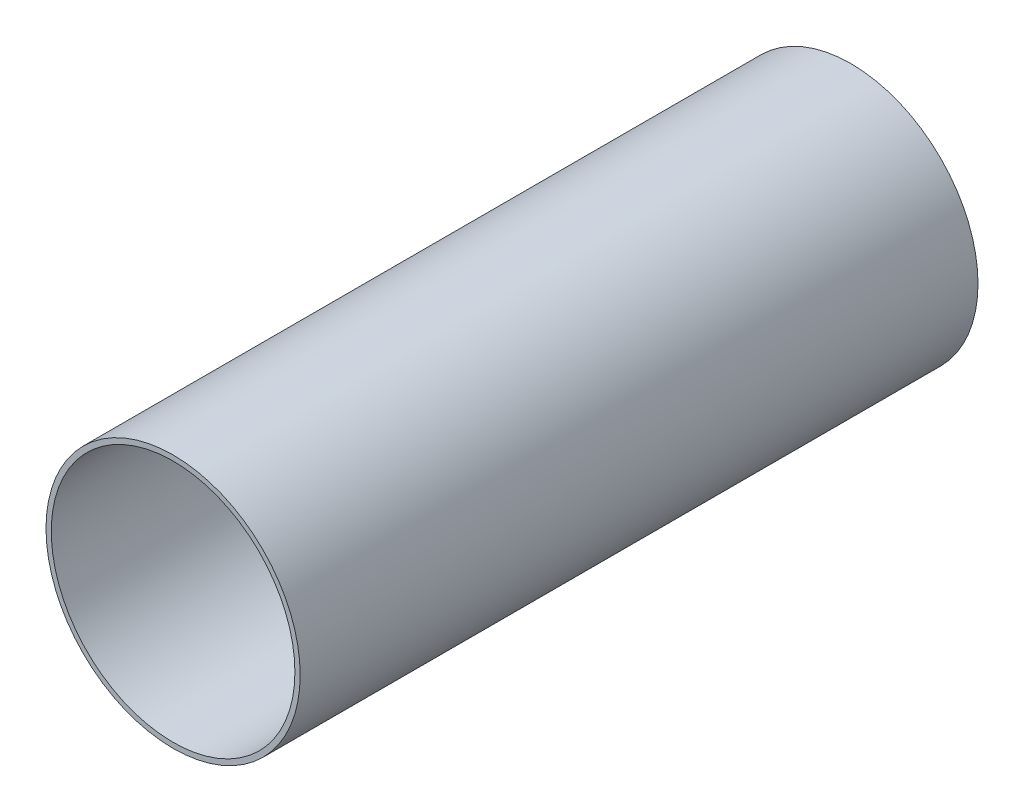
ISO-10303-21;
HEADER;
FILE_DESCRIPTION(('STEP AP214'),'2;1');
FILE_NAME('part.step','',(''),(''),'','','');
FILE_SCHEMA(('AUTOMOTIVE_DESIGN { 1 0 10303 214 1 1 1 1 }'));
ENDSEC;
DATA;
#1=APPLICATION_CONTEXT('core data for automotive mechanical design processes');
#2=APPLICATION_PROTOCOL_DEFINITION('international standard','automotive_design',2000,#1);
#3=PRODUCT_CONTEXT('',#1,'mechanical');
#4=PRODUCT('Part','Part','',(#3));
#5=PRODUCT_RELATED_PRODUCT_CATEGORY('part','',(#4));
#6=PRODUCT_DEFINITION_FORMATION('','',#4);
#7=PRODUCT_DEFINITION_CONTEXT('part definition',#1,'design');
#8=PRODUCT_DEFINITION('design','',#6,#7);
#9=PRODUCT_DEFINITION_SHAPE('','',#8);
#10=(LENGTH_UNIT() NAMED_UNIT(*) SI_UNIT(.MILLI.,.METRE.));
#11=(NAMED_UNIT(*) PLANE_ANGLE_UNIT() SI_UNIT($,.RADIAN.));
#12=(NAMED_UNIT(*) SI_UNIT($,.STERADIAN.) SOLID_ANGLE_UNIT());
#13=UNCERTAINTY_MEASURE_WITH_UNIT(LENGTH_MEASURE(1.E-05),#10,'distance_accuracy_value','');
#14=(GEOMETRIC_REPRESENTATION_CONTEXT(3) GLOBAL_UNCERTAINTY_ASSIGNED_CONTEXT((#13)) GLOBAL_UNIT_ASSIGNED_CONTEXT((#10,
#11,#12)) REPRESENTATION_CONTEXT('',''));
#15=CARTESIAN_POINT('',(0.,0.,0.));
#16=DIRECTION('',(0.,0.,1.));
#17=DIRECTION('',(1.,0.,0.));
#18=AXIS2_PLACEMENT_3D('',#15,#16,#17);
#19=CARTESIAN_POINT('',(0.,0.,203.2));
#20=DIRECTION('',(0.,0.,1.));
#21=DIRECTION('',(1.,0.,0.));
#22=AXIS2_PLACEMENT_3D('',#19,#20,#21);
#23=PLANE('',#22);
#24=CARTESIAN_POINT('',(0.,0.,203.2));
#25=DIRECTION('',(0.,0.,1.));
#26=DIRECTION('',(1.,0.,0.));
#27=AXIS2_PLACEMENT_3D('',#24,#25,#26);
#28=CIRCLE('',#27,38.1);
#29=CARTESIAN_POINT('',(38.1,0.,203.2));
#30=VERTEX_POINT('',#29);
#31=EDGE_CURVE('E10',#30,#30,#28,.T.);
#32=ORIENTED_EDGE('',*,*,#31,.T.);
#33=EDGE_LOOP('',(#32));
#34=FACE_BOUND('',#33,.T.);
#35=CARTESIAN_POINT('',(0.,0.,203.2));
#36=DIRECTION('',(0.,0.,1.));
#37=DIRECTION('',(1.,0.,0.));
#38=AXIS2_PLACEMENT_3D('',#35,#36,#37);
#39=CIRCLE('',#38,36.5252);
#40=CARTESIAN_POINT('',(36.5252,0.,203.2));
#41=VERTEX_POINT('',#40);
#42=EDGE_CURVE('E54',#41,#41,#39,.T.);
#43=ORIENTED_EDGE('',*,*,#42,.F.);
#44=EDGE_LOOP('',(#43));
#45=FACE_BOUND('',#44,.T.);
#46=ADVANCED_FACE('F41',(#34,#45),#23,.T.);
#47=CARTESIAN_POINT('',(0.,0.,0.));
#48=DIRECTION('',(0.,0.,1.));
#49=DIRECTION('',(1.,0.,0.));
#50=AXIS2_PLACEMENT_3D('',#47,#48,#49);
#51=PLANE('',#50);
#52=CARTESIAN_POINT('',(0.,0.,0.));
#53=DIRECTION('',(0.,0.,1.));
#54=DIRECTION('',(1.,0.,0.));
#55=AXIS2_PLACEMENT_3D('',#52,#53,#54);
#56=CIRCLE('',#55,38.1);
#57=CARTESIAN_POINT('',(38.1,0.,0.));
#58=VERTEX_POINT('',#57);
#59=EDGE_CURVE('E45',#58,#58,#56,.T.);
#60=ORIENTED_EDGE('',*,*,#59,.F.);
#61=EDGE_LOOP('',(#60));
#62=FACE_BOUND('',#61,.T.);
#63=CARTESIAN_POINT('',(0.,0.,0.));
#64=DIRECTION('',(0.,0.,1.));
#65=DIRECTION('',(1.,0.,0.));
#66=AXIS2_PLACEMENT_3D('',#63,#64,#65);
#67=CIRCLE('',#66,36.5252);
#68=CARTESIAN_POINT('',(36.5252,0.,0.));
#69=VERTEX_POINT('',#68);
#70=EDGE_CURVE('E56',#69,#69,#67,.T.);
#71=ORIENTED_EDGE('',*,*,#70,.T.);
#72=EDGE_LOOP('',(#71));
#73=FACE_BOUND('',#72,.T.);
#74=ADVANCED_FACE('F68',(#62,#73),#51,.F.);
#75=CARTESIAN_POINT('',(0.,0.,203.2));
#76=DIRECTION('',(0.,0.,-1.));
#77=DIRECTION('',(-1.,0.,0.));
#78=AXIS2_PLACEMENT_3D('',#75,#76,#77);
#79=CYLINDRICAL_SURFACE('',#78,38.1);
#80=ORIENTED_EDGE('',*,*,#31,.F.);
#81=EDGE_LOOP('',(#80));
#82=FACE_BOUND('',#81,.T.);
#83=ORIENTED_EDGE('',*,*,#59,.T.);
#84=EDGE_LOOP('',(#83));
#85=FACE_BOUND('',#84,.T.);
#86=ADVANCED_FACE('F43',(#82,#85),#79,.T.);
#87=CARTESIAN_POINT('',(0.,0.,203.2));
#88=DIRECTION('',(0.,0.,-1.));
#89=DIRECTION('',(-1.,0.,0.));
#90=AXIS2_PLACEMENT_3D('',#87,#88,#89);
#91=CYLINDRICAL_SURFACE('',#90,36.5252);
#92=ORIENTED_EDGE('',*,*,#42,.T.);
#93=EDGE_LOOP('',(#92));
#94=FACE_BOUND('',#93,.T.);
#95=ORIENTED_EDGE('',*,*,#70,.F.);
#96=EDGE_LOOP('',(#95));
#97=FACE_BOUND('',#96,.T.);
#98=ADVANCED_FACE('F64',(#94,#97),#91,.F.);
#99=CLOSED_SHELL('',(#46,#74,#86,#98));
#100=MANIFOLD_SOLID_BREP('B2',#99);
#101=ADVANCED_BREP_SHAPE_REPRESENTATION('',(#18,#100),#14);
#102=SHAPE_DEFINITION_REPRESENTATION(#9,#101);
ENDSEC;
END-ISO-10303-21;
